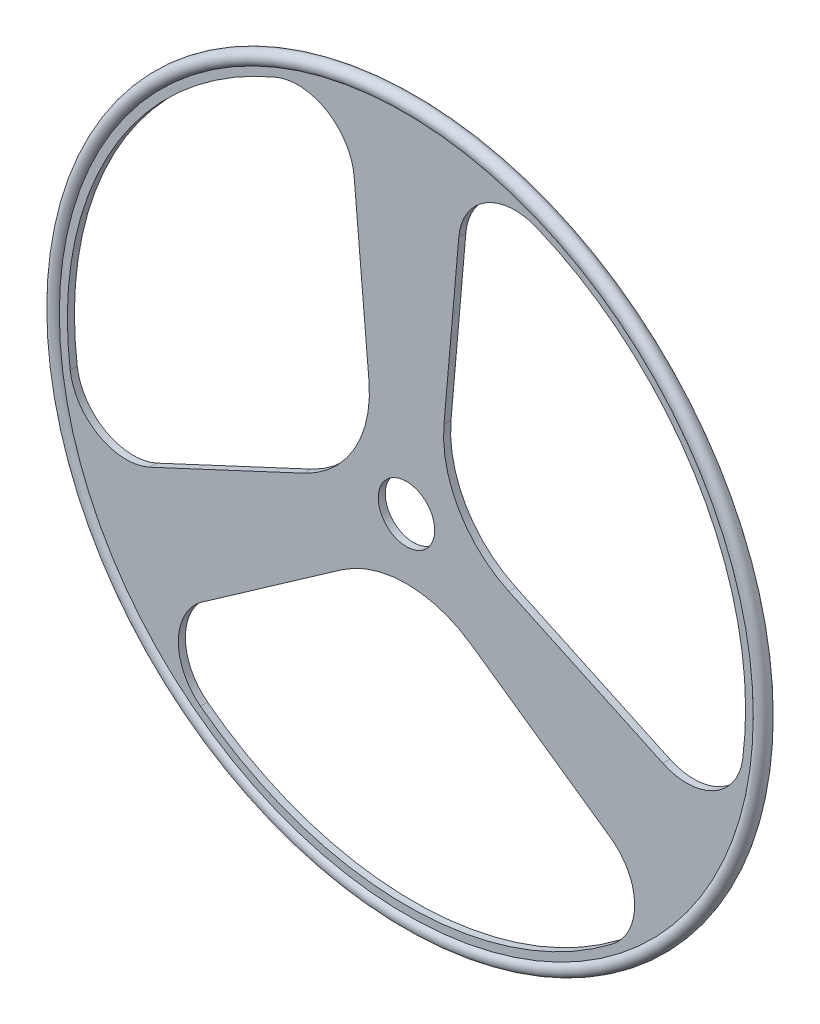
ISO-10303-21;
HEADER;
FILE_DESCRIPTION(('STEP AP214'),'2;1');
FILE_NAME('part.step','',(''),(''),'','','');
FILE_SCHEMA(('AUTOMOTIVE_DESIGN { 1 0 10303 214 1 1 1 1 }'));
ENDSEC;
DATA;
#1=APPLICATION_CONTEXT('core data for automotive mechanical design processes');
#2=APPLICATION_PROTOCOL_DEFINITION('international standard','automotive_design',2000,#1);
#3=PRODUCT_CONTEXT('',#1,'mechanical');
#4=PRODUCT('Part','Part','',(#3));
#5=PRODUCT_RELATED_PRODUCT_CATEGORY('part','',(#4));
#6=PRODUCT_DEFINITION_FORMATION('','',#4);
#7=PRODUCT_DEFINITION_CONTEXT('part definition',#1,'design');
#8=PRODUCT_DEFINITION('design','',#6,#7);
#9=PRODUCT_DEFINITION_SHAPE('','',#8);
#10=(LENGTH_UNIT() NAMED_UNIT(*) SI_UNIT(.MILLI.,.METRE.));
#11=(NAMED_UNIT(*) PLANE_ANGLE_UNIT() SI_UNIT($,.RADIAN.));
#12=(NAMED_UNIT(*) SI_UNIT($,.STERADIAN.) SOLID_ANGLE_UNIT());
#13=UNCERTAINTY_MEASURE_WITH_UNIT(LENGTH_MEASURE(1.E-05),#10,'distance_accuracy_value','');
#14=(GEOMETRIC_REPRESENTATION_CONTEXT(3) GLOBAL_UNCERTAINTY_ASSIGNED_CONTEXT((#13)) GLOBAL_UNIT_ASSIGNED_CONTEXT((#10,
#11,#12)) REPRESENTATION_CONTEXT('',''));
#15=CARTESIAN_POINT('',(0.,0.,0.));
#16=DIRECTION('',(0.,0.,1.));
#17=DIRECTION('',(1.,0.,0.));
#18=AXIS2_PLACEMENT_3D('',#15,#16,#17);
#19=CARTESIAN_POINT('',(0.,0.,0.));
#20=DIRECTION('',(0.,0.,1.));
#21=DIRECTION('',(1.,0.,0.));
#22=AXIS2_PLACEMENT_3D('',#19,#20,#21);
#23=TOROIDAL_SURFACE('',#22,250.,5.);
#24=CARTESIAN_POINT('',(255.,0.,0.));
#25=VERTEX_POINT('',#24);
#26=VERTEX_LOOP('',#25);
#27=FACE_BOUND('',#26,.T.);
#28=ADVANCED_FACE('F41',(#27),#23,.T.);
#29=CLOSED_SHELL('',(#28));
#30=MANIFOLD_SOLID_BREP('B2',#29);
#31=CARTESIAN_POINT('',(-6.59194920871187E-13,-122.661967100916,-2.5));
#32=DIRECTION('',(0.,0.,-1.));
#33=DIRECTION('',(-1.,0.,0.));
#34=AXIS2_PLACEMENT_3D('',#31,#32,#33);
#35=CYLINDRICAL_SURFACE('',#34,80.);
#36=DIRECTION('',(0.,0.,-1.));
#37=VECTOR('',#36,1.);
#38=CARTESIAN_POINT('',(45.8861149080833,-57.1298035577972,-2.5));
#39=LINE('',#38,#37);
#40=CARTESIAN_POINT('',(45.8861149080833,-57.1298035577972,2.5));
#41=VERTEX_POINT('',#40);
#42=CARTESIAN_POINT('',(45.8861149080833,-57.1298035577972,-2.5));
#43=VERTEX_POINT('',#42);
#44=EDGE_CURVE('E269',#41,#43,#39,.T.);
#45=ORIENTED_EDGE('',*,*,#44,.F.);
#46=CARTESIAN_POINT('',(-6.59194920871187E-13,-122.661967100916,2.5));
#47=DIRECTION('',(0.,0.,1.));
#48=DIRECTION('',(1.,0.,0.));
#49=AXIS2_PLACEMENT_3D('',#46,#47,#48);
#50=CIRCLE('',#49,80.);
#51=CARTESIAN_POINT('',(-45.8861149080837,-57.1298035577965,2.5));
#52=VERTEX_POINT('',#51);
#53=EDGE_CURVE('E61',#41,#52,#50,.T.);
#54=ORIENTED_EDGE('',*,*,#53,.T.);
#55=DIRECTION('',(0.,0.,-1.));
#56=VECTOR('',#55,1.);
#57=CARTESIAN_POINT('',(-45.8861149080836,-57.1298035577965,-2.5));
#58=LINE('',#57,#56);
#59=CARTESIAN_POINT('',(-45.8861149080837,-57.1298035577965,-2.5));
#60=VERTEX_POINT('',#59);
#61=EDGE_CURVE('E272',#60,#52,#58,.F.);
#62=ORIENTED_EDGE('',*,*,#61,.F.);
#63=CARTESIAN_POINT('',(-6.59194920871187E-13,-122.661967100916,-2.5));
#64=DIRECTION('',(0.,0.,1.));
#65=DIRECTION('',(1.,0.,0.));
#66=AXIS2_PLACEMENT_3D('',#63,#64,#65);
#67=CIRCLE('',#66,80.);
#68=EDGE_CURVE('E39',#60,#43,#67,.F.);
#69=ORIENTED_EDGE('',*,*,#68,.T.);
#70=EDGE_LOOP('',(#45,#54,#62,#69));
#71=FACE_BOUND('',#70,.T.);
#72=ADVANCED_FACE('F54',(#71),#35,.F.);
#73=CARTESIAN_POINT('',(106.228379587565,61.330983550458,-2.5));
#74=DIRECTION('',(0.,0.,-1.));
#75=DIRECTION('',(-1.,0.,0.));
#76=AXIS2_PLACEMENT_3D('',#73,#74,#75);
#77=CYLINDRICAL_SURFACE('',#76,80.);
#78=DIRECTION('',(0.,0.,-1.));
#79=VECTOR('',#78,1.);
#80=CARTESIAN_POINT('',(26.532803740225,68.3034429702706,-2.5));
#81=LINE('',#80,#79);
#82=CARTESIAN_POINT('',(26.532803740225,68.3034429702706,2.5));
#83=VERTEX_POINT('',#82);
#84=CARTESIAN_POINT('',(26.532803740225,68.3034429702706,-2.5));
#85=VERTEX_POINT('',#84);
#86=EDGE_CURVE('E259',#83,#85,#81,.T.);
#87=ORIENTED_EDGE('',*,*,#86,.F.);
#88=CARTESIAN_POINT('',(106.228379587565,61.330983550458,2.5));
#89=DIRECTION('',(0.,0.,1.));
#90=DIRECTION('',(1.,0.,0.));
#91=AXIS2_PLACEMENT_3D('',#88,#89,#90);
#92=CIRCLE('',#91,80.);
#93=CARTESIAN_POINT('',(72.4189186483083,-11.1736394124738,2.5));
#94=VERTEX_POINT('',#93);
#95=EDGE_CURVE('E265',#83,#94,#92,.T.);
#96=ORIENTED_EDGE('',*,*,#95,.T.);
#97=DIRECTION('',(0.,0.,-1.));
#98=VECTOR('',#97,1.);
#99=CARTESIAN_POINT('',(72.4189186483083,-11.1736394124738,-2.5));
#100=LINE('',#99,#98);
#101=CARTESIAN_POINT('',(72.4189186483083,-11.1736394124738,-2.5));
#102=VERTEX_POINT('',#101);
#103=EDGE_CURVE('E262',#102,#94,#100,.F.);
#104=ORIENTED_EDGE('',*,*,#103,.F.);
#105=CARTESIAN_POINT('',(106.228379587565,61.330983550458,-2.5));
#106=DIRECTION('',(0.,0.,1.));
#107=DIRECTION('',(1.,0.,0.));
#108=AXIS2_PLACEMENT_3D('',#105,#106,#107);
#109=CIRCLE('',#108,80.);
#110=EDGE_CURVE('E267',#102,#85,#109,.F.);
#111=ORIENTED_EDGE('',*,*,#110,.T.);
#112=EDGE_LOOP('',(#87,#96,#104,#111));
#113=FACE_BOUND('',#112,.T.);
#114=ADVANCED_FACE('F376',(#113),#77,.F.);
#115=CARTESIAN_POINT('',(-106.228379587565,61.3309835504589,-2.5));
#116=DIRECTION('',(0.,0.,1.));
#117=DIRECTION('',(1.,0.,0.));
#118=AXIS2_PLACEMENT_3D('',#115,#116,#117);
#119=CYLINDRICAL_SURFACE('',#118,80.);
#120=DIRECTION('',(0.,0.,1.));
#121=VECTOR('',#120,1.);
#122=CARTESIAN_POINT('',(-26.5328037402251,68.3034429702715,-2.5));
#123=LINE('',#122,#121);
#124=CARTESIAN_POINT('',(-26.5328037402251,68.3034429702714,-2.5));
#125=VERTEX_POINT('',#124);
#126=CARTESIAN_POINT('',(-26.5328037402251,68.3034429702714,2.5));
#127=VERTEX_POINT('',#126);
#128=EDGE_CURVE('E224',#125,#127,#123,.T.);
#129=ORIENTED_EDGE('',*,*,#128,.F.);
#130=CARTESIAN_POINT('',(-106.228379587565,61.3309835504589,-2.5));
#131=DIRECTION('',(0.,0.,1.));
#132=DIRECTION('',(1.,0.,0.));
#133=AXIS2_PLACEMENT_3D('',#130,#131,#132);
#134=CIRCLE('',#133,80.);
#135=CARTESIAN_POINT('',(-72.4189186483095,-11.1736394124734,-2.5));
#136=VERTEX_POINT('',#135);
#137=EDGE_CURVE('E255',#125,#136,#134,.F.);
#138=ORIENTED_EDGE('',*,*,#137,.T.);
#139=DIRECTION('',(0.,0.,1.));
#140=VECTOR('',#139,1.);
#141=CARTESIAN_POINT('',(-72.4189186483095,-11.1736394124734,-2.5));
#142=LINE('',#141,#140);
#143=CARTESIAN_POINT('',(-72.4189186483095,-11.1736394124734,2.5));
#144=VERTEX_POINT('',#143);
#145=EDGE_CURVE('E252',#144,#136,#142,.F.);
#146=ORIENTED_EDGE('',*,*,#145,.F.);
#147=CARTESIAN_POINT('',(-106.228379587565,61.3309835504589,2.5));
#148=DIRECTION('',(0.,0.,1.));
#149=DIRECTION('',(1.,0.,0.));
#150=AXIS2_PLACEMENT_3D('',#147,#148,#149);
#151=CIRCLE('',#150,80.);
#152=EDGE_CURVE('E257',#144,#127,#151,.T.);
#153=ORIENTED_EDGE('',*,*,#152,.T.);
#154=EDGE_LOOP('',(#129,#138,#146,#153));
#155=FACE_BOUND('',#154,.T.);
#156=ADVANCED_FACE('F380',(#155),#119,.F.);
#157=CARTESIAN_POINT('',(-198.334884096126,-25.7541016262696,-2.5));
#158=DIRECTION('',(0.,0.,1.));
#159=DIRECTION('',(1.,0.,0.));
#160=AXIS2_PLACEMENT_3D('',#157,#158,#159);
#161=CYLINDRICAL_SURFACE('',#160,40.);
#162=DIRECTION('',(0.,0.,1.));
#163=VECTOR('',#162,1.);
#164=CARTESIAN_POINT('',(-238.001860915351,-30.9049219515235,-2.5));
#165=LINE('',#164,#163);
#166=CARTESIAN_POINT('',(-238.001860915351,-30.9049219515235,-2.5));
#167=VERTEX_POINT('',#166);
#168=CARTESIAN_POINT('',(-238.001860915351,-30.9049219515235,2.5));
#169=VERTEX_POINT('',#168);
#170=EDGE_CURVE('E220',#167,#169,#165,.T.);
#171=ORIENTED_EDGE('',*,*,#170,.T.);
#172=CARTESIAN_POINT('',(-198.334884096126,-25.7541016262696,2.5));
#173=DIRECTION('',(0.,0.,1.));
#174=DIRECTION('',(1.,0.,0.));
#175=AXIS2_PLACEMENT_3D('',#172,#173,#174);
#176=CIRCLE('',#175,40.);
#177=CARTESIAN_POINT('',(-181.430153626498,-62.0064131077358,2.5));
#178=VERTEX_POINT('',#177);
#179=EDGE_CURVE('E290',#178,#169,#176,.F.);
#180=ORIENTED_EDGE('',*,*,#179,.F.);
#181=DIRECTION('',(0.,0.,1.));
#182=VECTOR('',#181,1.);
#183=CARTESIAN_POINT('',(-181.430153626498,-62.0064131077358,-2.5));
#184=LINE('',#183,#182);
#185=CARTESIAN_POINT('',(-181.430153626498,-62.0064131077358,-2.5));
#186=VERTEX_POINT('',#185);
#187=EDGE_CURVE('E221',#186,#178,#184,.T.);
#188=ORIENTED_EDGE('',*,*,#187,.F.);
#189=CARTESIAN_POINT('',(-198.334884096126,-25.7541016262696,-2.5));
#190=DIRECTION('',(0.,0.,1.));
#191=DIRECTION('',(1.,0.,0.));
#192=AXIS2_PLACEMENT_3D('',#189,#190,#191);
#193=CIRCLE('',#192,40.);
#194=EDGE_CURVE('E315',#186,#167,#193,.F.);
#195=ORIENTED_EDGE('',*,*,#194,.T.);
#196=EDGE_LOOP('',(#171,#180,#188,#195));
#197=FACE_BOUND('',#196,.T.);
#198=ADVANCED_FACE('F355',(#197),#161,.F.);
#199=CARTESIAN_POINT('',(-8.65471532646867,18.5600969126526,-2.5));
#200=DIRECTION('',(-0.422618261740691,0.906307787036654,0.));
#201=DIRECTION('',(-0.906307787036654,-0.422618261740691,0.));
#202=AXIS2_PLACEMENT_3D('',#199,#200,#201);
#203=PLANE('',#202);
#204=DIRECTION('',(-0.906307787036654,-0.422618261740691,0.));
#205=VECTOR('',#204,1.);
#206=CARTESIAN_POINT('',(-8.65471532646867,18.5600969126526,2.5));
#207=LINE('',#206,#205);
#208=EDGE_CURVE('E310',#144,#178,#207,.T.);
#209=ORIENTED_EDGE('',*,*,#208,.F.);
#210=ORIENTED_EDGE('',*,*,#145,.T.);
#211=DIRECTION('',(-0.906307787036654,-0.422618261740691,0.));
#212=VECTOR('',#211,1.);
#213=CARTESIAN_POINT('',(-8.65471532646867,18.5600969126526,-2.5));
#214=LINE('',#213,#212);
#215=EDGE_CURVE('E215',#136,#186,#214,.T.);
#216=ORIENTED_EDGE('',*,*,#215,.T.);
#217=ORIENTED_EDGE('',*,*,#187,.T.);
#218=EDGE_LOOP('',(#209,#210,#216,#217));
#219=FACE_BOUND('',#218,.T.);
#220=ADVANCED_FACE('F391',(#219),#203,.T.);
#221=CARTESIAN_POINT('',(-20.4008730862928,-1.78484512108173,-2.5));
#222=DIRECTION('',(0.996194698091746,0.0871557427476574,0.));
#223=DIRECTION('',(-0.0871557427476575,0.996194698091746,0.));
#224=AXIS2_PLACEMENT_3D('',#221,#222,#223);
#225=PLANE('',#224);
#226=DIRECTION('',(-0.0871557427476574,0.996194698091746,0.));
#227=VECTOR('',#226,1.);
#228=CARTESIAN_POINT('',(-20.4008730862928,-1.78484512108173,-2.5));
#229=LINE('',#228,#227);
#230=CARTESIAN_POINT('',(-37.0159478643959,188.126328606929,-2.5));
#231=VERTEX_POINT('',#230);
#232=EDGE_CURVE('E208',#125,#231,#229,.T.);
#233=ORIENTED_EDGE('',*,*,#232,.F.);
#234=ORIENTED_EDGE('',*,*,#128,.T.);
#235=DIRECTION('',(-0.0871557427476574,0.996194698091746,0.));
#236=VECTOR('',#235,1.);
#237=CARTESIAN_POINT('',(-20.4008730862928,-1.78484512108173,2.5));
#238=LINE('',#237,#236);
#239=CARTESIAN_POINT('',(-37.0159478643959,188.126328606929,2.5));
#240=VERTEX_POINT('',#239);
#241=EDGE_CURVE('E308',#127,#240,#238,.T.);
#242=ORIENTED_EDGE('',*,*,#241,.T.);
#243=DIRECTION('',(0.,0.,1.));
#244=VECTOR('',#243,1.);
#245=CARTESIAN_POINT('',(-37.0159478643959,188.126328606929,-2.5));
#246=LINE('',#245,#244);
#247=EDGE_CURVE('E225',#231,#240,#246,.T.);
#248=ORIENTED_EDGE('',*,*,#247,.F.);
#249=EDGE_LOOP('',(#233,#234,#242,#248));
#250=FACE_BOUND('',#249,.T.);
#251=ADVANCED_FACE('F416',(#250),#225,.F.);
#252=CARTESIAN_POINT('',(-76.8637357880657,184.640098897023,-2.5));
#253=DIRECTION('',(0.,0.,1.));
#254=DIRECTION('',(1.,0.,0.));
#255=AXIS2_PLACEMENT_3D('',#252,#253,#254);
#256=CYLINDRICAL_SURFACE('',#255,40.);
#257=ORIENTED_EDGE('',*,*,#247,.T.);
#258=CARTESIAN_POINT('',(-76.8637357880657,184.640098897023,2.5));
#259=DIRECTION('',(0.,0.,1.));
#260=DIRECTION('',(1.,0.,0.));
#261=AXIS2_PLACEMENT_3D('',#258,#259,#260);
#262=CIRCLE('',#261,40.);
#263=CARTESIAN_POINT('',(-92.2364829456789,221.568118676428,2.5));
#264=VERTEX_POINT('',#263);
#265=EDGE_CURVE('E305',#240,#264,#262,.T.);
#266=ORIENTED_EDGE('',*,*,#265,.T.);
#267=DIRECTION('',(0.,0.,1.));
#268=VECTOR('',#267,1.);
#269=CARTESIAN_POINT('',(-92.2364829456789,221.568118676428,-2.5));
#270=LINE('',#269,#268);
#271=CARTESIAN_POINT('',(-92.2364829456789,221.568118676428,-2.5));
#272=VERTEX_POINT('',#271);
#273=EDGE_CURVE('E185',#272,#264,#270,.T.);
#274=ORIENTED_EDGE('',*,*,#273,.F.);
#275=CARTESIAN_POINT('',(-76.8637357880657,184.640098897023,-2.5));
#276=DIRECTION('',(0.,0.,1.));
#277=DIRECTION('',(1.,0.,0.));
#278=AXIS2_PLACEMENT_3D('',#275,#276,#277);
#279=CIRCLE('',#278,40.);
#280=EDGE_CURVE('E204',#231,#272,#279,.T.);
#281=ORIENTED_EDGE('',*,*,#280,.F.);
#282=EDGE_LOOP('',(#257,#266,#274,#281));
#283=FACE_BOUND('',#282,.T.);
#284=ADVANCED_FACE('F413',(#283),#256,.F.);
#285=CARTESIAN_POINT('',(76.8637357880657,184.640098897023,-2.5));
#286=DIRECTION('',(0.,0.,1.));
#287=DIRECTION('',(1.,0.,0.));
#288=AXIS2_PLACEMENT_3D('',#285,#286,#287);
#289=CYLINDRICAL_SURFACE('',#288,40.);
#290=DIRECTION('',(0.,0.,1.));
#291=VECTOR('',#290,1.);
#292=CARTESIAN_POINT('',(92.2364829456789,221.568118676428,-2.5));
#293=LINE('',#292,#291);
#294=CARTESIAN_POINT('',(92.2364829456789,221.568118676428,-2.5));
#295=VERTEX_POINT('',#294);
#296=CARTESIAN_POINT('',(92.2364829456789,221.568118676428,2.5));
#297=VERTEX_POINT('',#296);
#298=EDGE_CURVE('E174',#295,#297,#293,.T.);
#299=ORIENTED_EDGE('',*,*,#298,.T.);
#300=CARTESIAN_POINT('',(76.8637357880657,184.640098897023,2.5));
#301=DIRECTION('',(0.,0.,1.));
#302=DIRECTION('',(1.,0.,0.));
#303=AXIS2_PLACEMENT_3D('',#300,#301,#302);
#304=CIRCLE('',#303,40.);
#305=CARTESIAN_POINT('',(37.0159478643959,188.126328606929,2.5));
#306=VERTEX_POINT('',#305);
#307=EDGE_CURVE('E303',#306,#297,#304,.F.);
#308=ORIENTED_EDGE('',*,*,#307,.F.);
#309=DIRECTION('',(0.,0.,1.));
#310=VECTOR('',#309,1.);
#311=CARTESIAN_POINT('',(37.0159478643959,188.126328606929,-2.5));
#312=LINE('',#311,#310);
#313=CARTESIAN_POINT('',(37.0159478643959,188.126328606929,-2.5));
#314=VERTEX_POINT('',#313);
#315=EDGE_CURVE('E186',#314,#306,#312,.T.);
#316=ORIENTED_EDGE('',*,*,#315,.F.);
#317=CARTESIAN_POINT('',(76.8637357880657,184.640098897023,-2.5));
#318=DIRECTION('',(0.,0.,1.));
#319=DIRECTION('',(1.,0.,0.));
#320=AXIS2_PLACEMENT_3D('',#317,#318,#319);
#321=CIRCLE('',#320,40.);
#322=EDGE_CURVE('E193',#314,#295,#321,.F.);
#323=ORIENTED_EDGE('',*,*,#322,.T.);
#324=EDGE_LOOP('',(#299,#308,#316,#323));
#325=FACE_BOUND('',#324,.T.);
#326=ADVANCED_FACE('F202',(#325),#289,.F.);
#327=CARTESIAN_POINT('',(20.4008730862927,-1.78484512108173,-2.5));
#328=DIRECTION('',(0.996194698091746,-0.0871557427476579,0.));
#329=DIRECTION('',(0.0871557427476579,0.996194698091746,0.));
#330=AXIS2_PLACEMENT_3D('',#327,#328,#329);
#331=PLANE('',#330);
#332=DIRECTION('',(0.0871557427476579,0.996194698091746,0.));
#333=VECTOR('',#332,1.);
#334=CARTESIAN_POINT('',(20.4008730862927,-1.78484512108173,2.5));
#335=LINE('',#334,#333);
#336=EDGE_CURVE('E301',#83,#306,#335,.T.);
#337=ORIENTED_EDGE('',*,*,#336,.F.);
#338=ORIENTED_EDGE('',*,*,#86,.T.);
#339=DIRECTION('',(0.0871557427476579,0.996194698091746,0.));
#340=VECTOR('',#339,1.);
#341=CARTESIAN_POINT('',(20.4008730862927,-1.78484512108173,-2.5));
#342=LINE('',#341,#340);
#343=EDGE_CURVE('E205',#85,#314,#342,.T.);
#344=ORIENTED_EDGE('',*,*,#343,.T.);
#345=ORIENTED_EDGE('',*,*,#315,.T.);
#346=EDGE_LOOP('',(#337,#338,#344,#345));
#347=FACE_BOUND('',#346,.T.);
#348=ADVANCED_FACE('F407',(#347),#331,.T.);
#349=CARTESIAN_POINT('',(8.65471532646901,18.5600969126527,-2.5));
#350=DIRECTION('',(-0.422618261740705,-0.906307787036648,0.));
#351=DIRECTION('',(0.906307787036648,-0.422618261740705,0.));
#352=AXIS2_PLACEMENT_3D('',#349,#350,#351);
#353=PLANE('',#352);
#354=DIRECTION('',(0.906307787036648,-0.422618261740705,0.));
#355=VECTOR('',#354,1.);
#356=CARTESIAN_POINT('',(8.65471532646901,18.5600969126527,-2.5));
#357=LINE('',#356,#355);
#358=CARTESIAN_POINT('',(181.430153626498,-62.0064131077383,-2.5));
#359=VERTEX_POINT('',#358);
#360=EDGE_CURVE('E210',#102,#359,#357,.T.);
#361=ORIENTED_EDGE('',*,*,#360,.F.);
#362=ORIENTED_EDGE('',*,*,#103,.T.);
#363=DIRECTION('',(0.906307787036648,-0.422618261740705,0.));
#364=VECTOR('',#363,1.);
#365=CARTESIAN_POINT('',(8.65471532646901,18.5600969126527,2.5));
#366=LINE('',#365,#364);
#367=CARTESIAN_POINT('',(181.430153626498,-62.0064131077383,2.5));
#368=VERTEX_POINT('',#367);
#369=EDGE_CURVE('E299',#94,#368,#366,.T.);
#370=ORIENTED_EDGE('',*,*,#369,.T.);
#371=DIRECTION('',(0.,0.,1.));
#372=VECTOR('',#371,1.);
#373=CARTESIAN_POINT('',(181.430153626498,-62.0064131077383,-2.5));
#374=LINE('',#373,#372);
#375=EDGE_CURVE('E231',#359,#368,#374,.T.);
#376=ORIENTED_EDGE('',*,*,#375,.F.);
#377=EDGE_LOOP('',(#361,#362,#370,#376));
#378=FACE_BOUND('',#377,.T.);
#379=ADVANCED_FACE('F331',(#378),#353,.F.);
#380=CARTESIAN_POINT('',(198.334884096126,-25.7541016262724,-2.5));
#381=DIRECTION('',(0.,0.,1.));
#382=DIRECTION('',(1.,0.,0.));
#383=AXIS2_PLACEMENT_3D('',#380,#381,#382);
#384=CYLINDRICAL_SURFACE('',#383,40.);
#385=ORIENTED_EDGE('',*,*,#375,.T.);
#386=CARTESIAN_POINT('',(198.334884096126,-25.7541016262724,2.5));
#387=DIRECTION('',(0.,0.,1.));
#388=DIRECTION('',(1.,0.,0.));
#389=AXIS2_PLACEMENT_3D('',#386,#387,#388);
#390=CIRCLE('',#389,40.);
#391=CARTESIAN_POINT('',(238.001860915351,-30.9049219515269,2.5));
#392=VERTEX_POINT('',#391);
#393=EDGE_CURVE('E296',#368,#392,#390,.T.);
#394=ORIENTED_EDGE('',*,*,#393,.T.);
#395=DIRECTION('',(0.,0.,1.));
#396=VECTOR('',#395,1.);
#397=CARTESIAN_POINT('',(238.001860915351,-30.9049219515269,-2.5));
#398=LINE('',#397,#396);
#399=CARTESIAN_POINT('',(238.001860915351,-30.9049219515269,-2.5));
#400=VERTEX_POINT('',#399);
#401=EDGE_CURVE('E234',#400,#392,#398,.T.);
#402=ORIENTED_EDGE('',*,*,#401,.F.);
#403=CARTESIAN_POINT('',(198.334884096126,-25.7541016262724,-2.5));
#404=DIRECTION('',(0.,0.,1.));
#405=DIRECTION('',(1.,0.,0.));
#406=AXIS2_PLACEMENT_3D('',#403,#404,#405);
#407=CIRCLE('',#406,40.);
#408=EDGE_CURVE('E195',#359,#400,#407,.T.);
#409=ORIENTED_EDGE('',*,*,#408,.F.);
#410=EDGE_LOOP('',(#385,#394,#402,#409));
#411=FACE_BOUND('',#410,.T.);
#412=ADVANCED_FACE('F335',(#411),#384,.F.);
#413=CARTESIAN_POINT('',(121.471148308059,-158.885997270752,-2.5));
#414=DIRECTION('',(0.,0.,1.));
#415=DIRECTION('',(1.,0.,0.));
#416=AXIS2_PLACEMENT_3D('',#413,#414,#415);
#417=CYLINDRICAL_SURFACE('',#416,40.);
#418=DIRECTION('',(0.,0.,1.));
#419=VECTOR('',#418,1.);
#420=CARTESIAN_POINT('',(145.765377969671,-190.663196724902,-2.5));
#421=LINE('',#420,#419);
#422=CARTESIAN_POINT('',(145.765377969671,-190.663196724902,-2.5));
#423=VERTEX_POINT('',#422);
#424=CARTESIAN_POINT('',(145.765377969671,-190.663196724902,2.5));
#425=VERTEX_POINT('',#424);
#426=EDGE_CURVE('E236',#423,#425,#421,.T.);
#427=ORIENTED_EDGE('',*,*,#426,.T.);
#428=CARTESIAN_POINT('',(121.471148308059,-158.885997270752,2.5));
#429=DIRECTION('',(0.,0.,1.));
#430=DIRECTION('',(1.,0.,0.));
#431=AXIS2_PLACEMENT_3D('',#428,#429,#430);
#432=CIRCLE('',#431,40.);
#433=CARTESIAN_POINT('',(144.414205762101,-126.119915499193,2.5));
#434=VERTEX_POINT('',#433);
#435=EDGE_CURVE('E288',#434,#425,#432,.F.);
#436=ORIENTED_EDGE('',*,*,#435,.F.);
#437=DIRECTION('',(0.,0.,1.));
#438=VECTOR('',#437,1.);
#439=CARTESIAN_POINT('',(144.414205762101,-126.119915499193,-2.5));
#440=LINE('',#439,#438);
#441=CARTESIAN_POINT('',(144.414205762101,-126.119915499193,-2.5));
#442=VERTEX_POINT('',#441);
#443=EDGE_CURVE('E239',#442,#434,#440,.T.);
#444=ORIENTED_EDGE('',*,*,#443,.F.);
#445=CARTESIAN_POINT('',(121.471148308059,-158.885997270752,-2.5));
#446=DIRECTION('',(0.,0.,1.));
#447=DIRECTION('',(1.,0.,0.));
#448=AXIS2_PLACEMENT_3D('',#445,#446,#447);
#449=CIRCLE('',#448,40.);
#450=EDGE_CURVE('E324',#442,#423,#449,.F.);
#451=ORIENTED_EDGE('',*,*,#450,.T.);
#452=EDGE_LOOP('',(#427,#436,#444,#451));
#453=FACE_BOUND('',#452,.T.);
#454=ADVANCED_FACE('F370',(#453),#417,.F.);
#455=CARTESIAN_POINT('',(-11.7461577598239,-16.7752517915707,-2.5));
#456=DIRECTION('',(-0.57357643635105,-0.819152044288989,0.));
#457=DIRECTION('',(0.819152044288989,-0.57357643635105,0.));
#458=AXIS2_PLACEMENT_3D('',#455,#456,#457);
#459=PLANE('',#458);
#460=DIRECTION('',(0.819152044288989,-0.57357643635105,0.));
#461=VECTOR('',#460,1.);
#462=CARTESIAN_POINT('',(-11.7461577598239,-16.7752517915707,2.5));
#463=LINE('',#462,#461);
#464=EDGE_CURVE('E286',#41,#434,#463,.T.);
#465=ORIENTED_EDGE('',*,*,#464,.F.);
#466=ORIENTED_EDGE('',*,*,#44,.T.);
#467=DIRECTION('',(0.819152044288989,-0.57357643635105,0.));
#468=VECTOR('',#467,1.);
#469=CARTESIAN_POINT('',(-11.7461577598239,-16.7752517915707,-2.5));
#470=LINE('',#469,#468);
#471=EDGE_CURVE('E322',#43,#442,#470,.T.);
#472=ORIENTED_EDGE('',*,*,#471,.T.);
#473=ORIENTED_EDGE('',*,*,#443,.T.);
#474=EDGE_LOOP('',(#465,#466,#472,#473));
#475=FACE_BOUND('',#474,.T.);
#476=ADVANCED_FACE('F374',(#475),#459,.T.);
#477=CARTESIAN_POINT('',(11.7461577598238,-16.7752517915712,-2.5));
#478=DIRECTION('',(-0.573576436351037,0.819152044288998,0.));
#479=DIRECTION('',(-0.819152044288998,-0.573576436351037,0.));
#480=AXIS2_PLACEMENT_3D('',#477,#478,#479);
#481=PLANE('',#480);
#482=DIRECTION('',(-0.819152044288998,-0.573576436351037,0.));
#483=VECTOR('',#482,1.);
#484=CARTESIAN_POINT('',(11.7461577598238,-16.7752517915712,-2.5));
#485=LINE('',#484,#483);
#486=CARTESIAN_POINT('',(-144.414205762103,-126.11991549919,-2.5));
#487=VERTEX_POINT('',#486);
#488=EDGE_CURVE('E279',#60,#487,#485,.T.);
#489=ORIENTED_EDGE('',*,*,#488,.F.);
#490=ORIENTED_EDGE('',*,*,#61,.T.);
#491=DIRECTION('',(-0.819152044288998,-0.573576436351037,0.));
#492=VECTOR('',#491,1.);
#493=CARTESIAN_POINT('',(11.7461577598238,-16.7752517915712,2.5));
#494=LINE('',#493,#492);
#495=CARTESIAN_POINT('',(-144.414205762103,-126.11991549919,2.5));
#496=VERTEX_POINT('',#495);
#497=EDGE_CURVE('E278',#52,#496,#494,.T.);
#498=ORIENTED_EDGE('',*,*,#497,.T.);
#499=DIRECTION('',(0.,0.,1.));
#500=VECTOR('',#499,1.);
#501=CARTESIAN_POINT('',(-144.414205762103,-126.11991549919,-2.5));
#502=LINE('',#501,#500);
#503=EDGE_CURVE('E242',#487,#496,#502,.T.);
#504=ORIENTED_EDGE('',*,*,#503,.F.);
#505=EDGE_LOOP('',(#489,#490,#498,#504));
#506=FACE_BOUND('',#505,.T.);
#507=ADVANCED_FACE('F276',(#506),#481,.F.);
#508=CARTESIAN_POINT('',(-121.471148308062,-158.88599727075,-2.5));
#509=DIRECTION('',(0.,0.,1.));
#510=DIRECTION('',(1.,0.,0.));
#511=AXIS2_PLACEMENT_3D('',#508,#509,#510);
#512=CYLINDRICAL_SURFACE('',#511,40.);
#513=ORIENTED_EDGE('',*,*,#503,.T.);
#514=CARTESIAN_POINT('',(-121.471148308062,-158.88599727075,2.5));
#515=DIRECTION('',(0.,0.,1.));
#516=DIRECTION('',(1.,0.,0.));
#517=AXIS2_PLACEMENT_3D('',#514,#515,#516);
#518=CIRCLE('',#517,40.);
#519=CARTESIAN_POINT('',(-145.765377969674,-190.6631967249,2.5));
#520=VERTEX_POINT('',#519);
#521=EDGE_CURVE('E285',#496,#520,#518,.T.);
#522=ORIENTED_EDGE('',*,*,#521,.T.);
#523=DIRECTION('',(0.,0.,1.));
#524=VECTOR('',#523,1.);
#525=CARTESIAN_POINT('',(-145.765377969674,-190.6631967249,-2.5));
#526=LINE('',#525,#524);
#527=CARTESIAN_POINT('',(-145.765377969674,-190.6631967249,-2.5));
#528=VERTEX_POINT('',#527);
#529=EDGE_CURVE('E245',#528,#520,#526,.T.);
#530=ORIENTED_EDGE('',*,*,#529,.F.);
#531=CARTESIAN_POINT('',(-121.471148308062,-158.88599727075,-2.5));
#532=DIRECTION('',(0.,0.,1.));
#533=DIRECTION('',(1.,0.,0.));
#534=AXIS2_PLACEMENT_3D('',#531,#532,#533);
#535=CIRCLE('',#534,40.);
#536=EDGE_CURVE('E318',#487,#528,#535,.T.);
#537=ORIENTED_EDGE('',*,*,#536,.F.);
#538=EDGE_LOOP('',(#513,#522,#530,#537));
#539=FACE_BOUND('',#538,.T.);
#540=ADVANCED_FACE('F392',(#539),#512,.F.);
#541=CARTESIAN_POINT('',(0.,0.,-2.5));
#542=DIRECTION('',(0.,0.,1.));
#543=DIRECTION('',(1.,0.,0.));
#544=AXIS2_PLACEMENT_3D('',#541,#542,#543);
#545=CYLINDRICAL_SURFACE('',#544,20.);
#546=CARTESIAN_POINT('',(0.,0.,-2.5));
#547=DIRECTION('',(0.,0.,1.));
#548=DIRECTION('',(1.,0.,0.));
#549=AXIS2_PLACEMENT_3D('',#546,#547,#548);
#550=CIRCLE('',#549,20.);
#551=CARTESIAN_POINT('',(20.,0.,-2.5));
#552=VERTEX_POINT('',#551);
#553=EDGE_CURVE('E217',#552,#552,#550,.T.);
#554=ORIENTED_EDGE('',*,*,#553,.F.);
#555=EDGE_LOOP('',(#554));
#556=FACE_BOUND('',#555,.T.);
#557=CARTESIAN_POINT('',(0.,0.,2.5));
#558=DIRECTION('',(0.,0.,1.));
#559=DIRECTION('',(1.,0.,0.));
#560=AXIS2_PLACEMENT_3D('',#557,#558,#559);
#561=CIRCLE('',#560,20.);
#562=CARTESIAN_POINT('',(20.,0.,2.5));
#563=VERTEX_POINT('',#562);
#564=EDGE_CURVE('E312',#563,#563,#561,.T.);
#565=ORIENTED_EDGE('',*,*,#564,.T.);
#566=EDGE_LOOP('',(#565));
#567=FACE_BOUND('',#566,.T.);
#568=ADVANCED_FACE('F395',(#556,#567),#545,.F.);
#569=CARTESIAN_POINT('',(0.,0.,-2.5));
#570=DIRECTION('',(0.,0.,1.));
#571=DIRECTION('',(1.,0.,0.));
#572=AXIS2_PLACEMENT_3D('',#569,#570,#571);
#573=PLANE('',#572);
#574=ORIENTED_EDGE('',*,*,#68,.F.);
#575=ORIENTED_EDGE('',*,*,#488,.T.);
#576=ORIENTED_EDGE('',*,*,#536,.T.);
#577=CARTESIAN_POINT('',(0.,0.,-2.5));
#578=DIRECTION('',(0.,0.,1.));
#579=DIRECTION('',(1.,0.,0.));
#580=AXIS2_PLACEMENT_3D('',#577,#578,#579);
#581=CIRCLE('',#580,240.);
#582=EDGE_CURVE('E197',#528,#423,#581,.T.);
#583=ORIENTED_EDGE('',*,*,#582,.T.);
#584=ORIENTED_EDGE('',*,*,#450,.F.);
#585=ORIENTED_EDGE('',*,*,#471,.F.);
#586=EDGE_LOOP('',(#574,#575,#576,#583,#584,#585));
#587=FACE_BOUND('',#586,.T.);
#588=ORIENTED_EDGE('',*,*,#110,.F.);
#589=ORIENTED_EDGE('',*,*,#360,.T.);
#590=ORIENTED_EDGE('',*,*,#408,.T.);
#591=EDGE_CURVE('E178',#400,#295,#581,.T.);
#592=ORIENTED_EDGE('',*,*,#591,.T.);
#593=ORIENTED_EDGE('',*,*,#322,.F.);
#594=ORIENTED_EDGE('',*,*,#343,.F.);
#595=EDGE_LOOP('',(#588,#589,#590,#592,#593,#594));
#596=FACE_BOUND('',#595,.T.);
#597=ORIENTED_EDGE('',*,*,#137,.F.);
#598=ORIENTED_EDGE('',*,*,#232,.T.);
#599=ORIENTED_EDGE('',*,*,#280,.T.);
#600=EDGE_CURVE('E200',#272,#167,#581,.T.);
#601=ORIENTED_EDGE('',*,*,#600,.T.);
#602=ORIENTED_EDGE('',*,*,#194,.F.);
#603=ORIENTED_EDGE('',*,*,#215,.F.);
#604=EDGE_LOOP('',(#597,#598,#599,#601,#602,#603));
#605=FACE_BOUND('',#604,.T.);
#606=ORIENTED_EDGE('',*,*,#553,.T.);
#607=EDGE_LOOP('',(#606));
#608=FACE_BOUND('',#607,.T.);
#609=CARTESIAN_POINT('',(0.,0.,-2.5));
#610=DIRECTION('',(0.,0.,1.));
#611=DIRECTION('',(1.,0.,0.));
#612=AXIS2_PLACEMENT_3D('',#609,#610,#611);
#613=CIRCLE('',#612,250.);
#614=CARTESIAN_POINT('',(250.,0.,-2.5));
#615=VERTEX_POINT('',#614);
#616=EDGE_CURVE('E346',#615,#615,#613,.T.);
#617=ORIENTED_EDGE('',*,*,#616,.F.);
#618=EDGE_LOOP('',(#617));
#619=FACE_BOUND('',#618,.T.);
#620=ADVANCED_FACE('F190',(#587,#596,#605,#608,#619),#573,.F.);
#621=CARTESIAN_POINT('',(0.,0.,2.5));
#622=DIRECTION('',(0.,0.,1.));
#623=DIRECTION('',(1.,0.,0.));
#624=AXIS2_PLACEMENT_3D('',#621,#622,#623);
#625=PLANE('',#624);
#626=ORIENTED_EDGE('',*,*,#53,.F.);
#627=ORIENTED_EDGE('',*,*,#464,.T.);
#628=ORIENTED_EDGE('',*,*,#435,.T.);
#629=CARTESIAN_POINT('',(0.,0.,2.5));
#630=DIRECTION('',(0.,0.,1.));
#631=DIRECTION('',(1.,0.,0.));
#632=AXIS2_PLACEMENT_3D('',#629,#630,#631);
#633=CIRCLE('',#632,240.);
#634=EDGE_CURVE('E337',#520,#425,#633,.T.);
#635=ORIENTED_EDGE('',*,*,#634,.F.);
#636=ORIENTED_EDGE('',*,*,#521,.F.);
#637=ORIENTED_EDGE('',*,*,#497,.F.);
#638=EDGE_LOOP('',(#626,#627,#628,#635,#636,#637));
#639=FACE_BOUND('',#638,.T.);
#640=ORIENTED_EDGE('',*,*,#95,.F.);
#641=ORIENTED_EDGE('',*,*,#336,.T.);
#642=ORIENTED_EDGE('',*,*,#307,.T.);
#643=EDGE_CURVE('E180',#392,#297,#633,.T.);
#644=ORIENTED_EDGE('',*,*,#643,.F.);
#645=ORIENTED_EDGE('',*,*,#393,.F.);
#646=ORIENTED_EDGE('',*,*,#369,.F.);
#647=EDGE_LOOP('',(#640,#641,#642,#644,#645,#646));
#648=FACE_BOUND('',#647,.T.);
#649=ORIENTED_EDGE('',*,*,#152,.F.);
#650=ORIENTED_EDGE('',*,*,#208,.T.);
#651=ORIENTED_EDGE('',*,*,#179,.T.);
#652=EDGE_CURVE('E339',#264,#169,#633,.T.);
#653=ORIENTED_EDGE('',*,*,#652,.F.);
#654=ORIENTED_EDGE('',*,*,#265,.F.);
#655=ORIENTED_EDGE('',*,*,#241,.F.);
#656=EDGE_LOOP('',(#649,#650,#651,#653,#654,#655));
#657=FACE_BOUND('',#656,.T.);
#658=ORIENTED_EDGE('',*,*,#564,.F.);
#659=EDGE_LOOP('',(#658));
#660=FACE_BOUND('',#659,.T.);
#661=CARTESIAN_POINT('',(0.,0.,2.5));
#662=DIRECTION('',(0.,0.,1.));
#663=DIRECTION('',(1.,0.,0.));
#664=AXIS2_PLACEMENT_3D('',#661,#662,#663);
#665=CIRCLE('',#664,250.);
#666=CARTESIAN_POINT('',(250.,0.,2.5));
#667=VERTEX_POINT('',#666);
#668=EDGE_CURVE('E198',#667,#667,#665,.T.);
#669=ORIENTED_EDGE('',*,*,#668,.T.);
#670=EDGE_LOOP('',(#669));
#671=FACE_BOUND('',#670,.T.);
#672=ADVANCED_FACE('F282',(#639,#648,#657,#660,#671),#625,.T.);
#673=CARTESIAN_POINT('',(0.,0.,-2.5));
#674=DIRECTION('',(0.,0.,1.));
#675=DIRECTION('',(1.,0.,0.));
#676=AXIS2_PLACEMENT_3D('',#673,#674,#675);
#677=CYLINDRICAL_SURFACE('',#676,240.);
#678=ORIENTED_EDGE('',*,*,#170,.F.);
#679=ORIENTED_EDGE('',*,*,#600,.F.);
#680=ORIENTED_EDGE('',*,*,#273,.T.);
#681=ORIENTED_EDGE('',*,*,#652,.T.);
#682=EDGE_LOOP('',(#678,#679,#680,#681));
#683=FACE_BOUND('',#682,.T.);
#684=ADVANCED_FACE('F358',(#683),#677,.F.);
#685=ORIENTED_EDGE('',*,*,#298,.F.);
#686=ORIENTED_EDGE('',*,*,#591,.F.);
#687=ORIENTED_EDGE('',*,*,#401,.T.);
#688=ORIENTED_EDGE('',*,*,#643,.T.);
#689=EDGE_LOOP('',(#685,#686,#687,#688));
#690=FACE_BOUND('',#689,.T.);
#691=ADVANCED_FACE('F176',(#690),#677,.F.);
#692=ORIENTED_EDGE('',*,*,#426,.F.);
#693=ORIENTED_EDGE('',*,*,#582,.F.);
#694=ORIENTED_EDGE('',*,*,#529,.T.);
#695=ORIENTED_EDGE('',*,*,#634,.T.);
#696=EDGE_LOOP('',(#692,#693,#694,#695));
#697=FACE_BOUND('',#696,.T.);
#698=ADVANCED_FACE('F431',(#697),#677,.F.);
#699=CARTESIAN_POINT('',(0.,0.,-2.5));
#700=DIRECTION('',(0.,0.,1.));
#701=DIRECTION('',(1.,0.,0.));
#702=AXIS2_PLACEMENT_3D('',#699,#700,#701);
#703=CYLINDRICAL_SURFACE('',#702,250.);
#704=ORIENTED_EDGE('',*,*,#616,.T.);
#705=EDGE_LOOP('',(#704));
#706=FACE_BOUND('',#705,.T.);
#707=ORIENTED_EDGE('',*,*,#668,.F.);
#708=EDGE_LOOP('',(#707));
#709=FACE_BOUND('',#708,.T.);
#710=ADVANCED_FACE('F434',(#706,#709),#703,.T.);
#711=CLOSED_SHELL('',(#72,#114,#156,#198,#220,#251,#284,#326,#348,#379,#412,#454,#476,#507,#540,
#568,#620,#672,#684,#691,#698,#710));
#712=MANIFOLD_SOLID_BREP('B6',#711);
#713=ADVANCED_BREP_SHAPE_REPRESENTATION('',(#18,#30,#712),#14);
#714=SHAPE_DEFINITION_REPRESENTATION(#9,#713);
ENDSEC;
END-ISO-10303-21;
